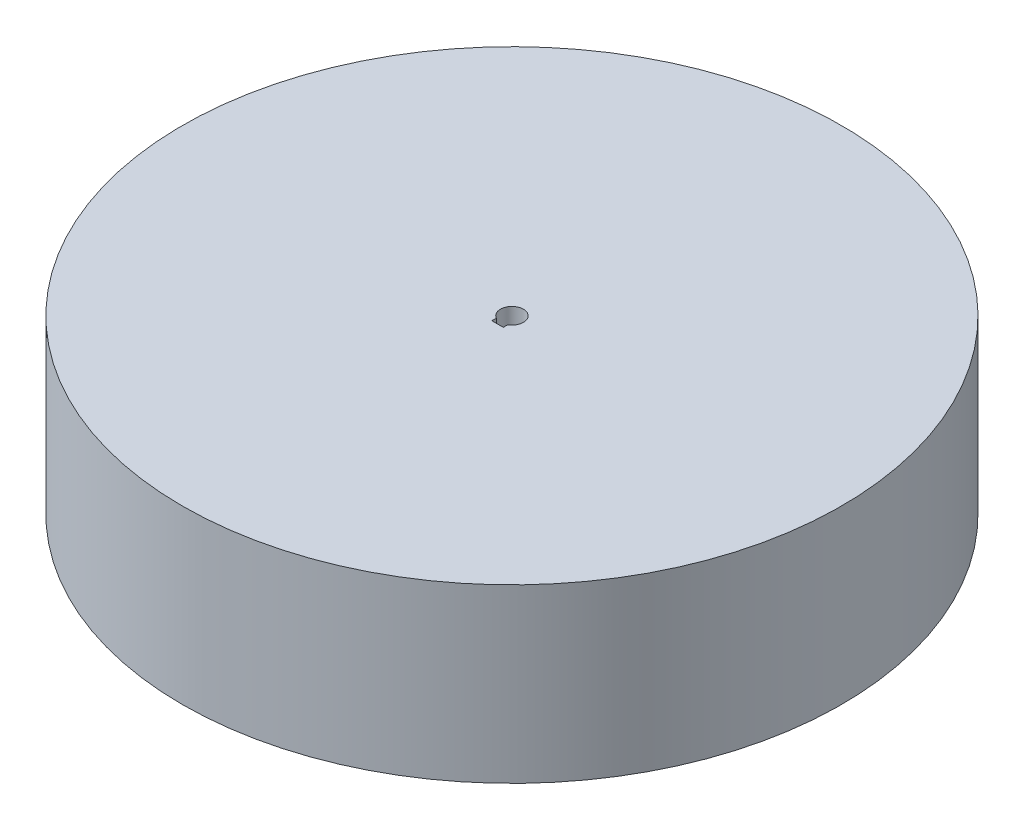
ISO-10303-21;
HEADER;
FILE_DESCRIPTION(('STEP AP214'),'2;1');
FILE_NAME('part.step','',(''),(''),'','','');
FILE_SCHEMA(('AUTOMOTIVE_DESIGN { 1 0 10303 214 1 1 1 1 }'));
ENDSEC;
DATA;
#1=APPLICATION_CONTEXT('core data for automotive mechanical design processes');
#2=APPLICATION_PROTOCOL_DEFINITION('international standard','automotive_design',2000,#1);
#3=PRODUCT_CONTEXT('',#1,'mechanical');
#4=PRODUCT('Part','Part','',(#3));
#5=PRODUCT_RELATED_PRODUCT_CATEGORY('part','',(#4));
#6=PRODUCT_DEFINITION_FORMATION('','',#4);
#7=PRODUCT_DEFINITION_CONTEXT('part definition',#1,'design');
#8=PRODUCT_DEFINITION('design','',#6,#7);
#9=PRODUCT_DEFINITION_SHAPE('','',#8);
#10=(LENGTH_UNIT() NAMED_UNIT(*) SI_UNIT(.MILLI.,.METRE.));
#11=(NAMED_UNIT(*) PLANE_ANGLE_UNIT() SI_UNIT($,.RADIAN.));
#12=(NAMED_UNIT(*) SI_UNIT($,.STERADIAN.) SOLID_ANGLE_UNIT());
#13=UNCERTAINTY_MEASURE_WITH_UNIT(LENGTH_MEASURE(1.E-05),#10,'distance_accuracy_value','');
#14=(GEOMETRIC_REPRESENTATION_CONTEXT(3) GLOBAL_UNCERTAINTY_ASSIGNED_CONTEXT((#13)) GLOBAL_UNIT_ASSIGNED_CONTEXT((#10,
#11,#12)) REPRESENTATION_CONTEXT('',''));
#15=CARTESIAN_POINT('',(0.,0.,0.));
#16=DIRECTION('',(0.,0.,1.));
#17=DIRECTION('',(1.,0.,0.));
#18=AXIS2_PLACEMENT_3D('',#15,#16,#17);
#19=CARTESIAN_POINT('',(0.,30.,0.));
#20=DIRECTION('',(0.,-1.,0.));
#21=DIRECTION('',(0.,0.,-1.));
#22=AXIS2_PLACEMENT_3D('',#19,#20,#21);
#23=CYLINDRICAL_SURFACE('',#22,57.5);
#24=CARTESIAN_POINT('',(0.,30.,0.));
#25=DIRECTION('',(0.,1.,0.));
#26=DIRECTION('',(0.,0.,1.));
#27=AXIS2_PLACEMENT_3D('',#24,#25,#26);
#28=CIRCLE('',#27,57.5);
#29=CARTESIAN_POINT('',(0.,30.,57.5));
#30=VERTEX_POINT('',#29);
#31=EDGE_CURVE('E11',#30,#30,#28,.T.);
#32=ORIENTED_EDGE('',*,*,#31,.F.);
#33=EDGE_LOOP('',(#32));
#34=FACE_BOUND('',#33,.T.);
#35=CARTESIAN_POINT('',(0.,0.,0.));
#36=DIRECTION('',(0.,1.,0.));
#37=DIRECTION('',(0.,0.,1.));
#38=AXIS2_PLACEMENT_3D('',#35,#36,#37);
#39=CIRCLE('',#38,57.5);
#40=CARTESIAN_POINT('',(0.,0.,57.5));
#41=VERTEX_POINT('',#40);
#42=EDGE_CURVE('E42',#41,#41,#39,.T.);
#43=ORIENTED_EDGE('',*,*,#42,.T.);
#44=EDGE_LOOP('',(#43));
#45=FACE_BOUND('',#44,.T.);
#46=ADVANCED_FACE('F39',(#34,#45),#23,.T.);
#47=CARTESIAN_POINT('',(0.,30.,0.));
#48=DIRECTION('',(0.,1.,0.));
#49=DIRECTION('',(0.,0.,1.));
#50=AXIS2_PLACEMENT_3D('',#47,#48,#49);
#51=PLANE('',#50);
#52=DIRECTION('',(-1.,0.,0.));
#53=VECTOR('',#52,1.);
#54=CARTESIAN_POINT('',(0.,30.,2.5));
#55=LINE('',#54,#53);
#56=CARTESIAN_POINT('',(1.,30.,2.5));
#57=VERTEX_POINT('',#56);
#58=CARTESIAN_POINT('',(-1.,30.,2.5));
#59=VERTEX_POINT('',#58);
#60=EDGE_CURVE('E83',#57,#59,#55,.T.);
#61=ORIENTED_EDGE('',*,*,#60,.T.);
#62=DIRECTION('',(0.,0.,-1.));
#63=VECTOR('',#62,1.);
#64=CARTESIAN_POINT('',(-1.,30.,0.));
#65=LINE('',#64,#63);
#66=CARTESIAN_POINT('',(-1.,30.,1.73205080756888));
#67=VERTEX_POINT('',#66);
#68=EDGE_CURVE('E93',#59,#67,#65,.T.);
#69=ORIENTED_EDGE('',*,*,#68,.T.);
#70=CARTESIAN_POINT('',(0.,30.,0.));
#71=DIRECTION('',(0.,-1.,0.));
#72=DIRECTION('',(0.,0.,-1.));
#73=AXIS2_PLACEMENT_3D('',#70,#71,#72);
#74=CIRCLE('',#73,2.);
#75=CARTESIAN_POINT('',(1.,30.,1.73205080756888));
#76=VERTEX_POINT('',#75);
#77=EDGE_CURVE('E54',#67,#76,#74,.T.);
#78=ORIENTED_EDGE('',*,*,#77,.T.);
#79=DIRECTION('',(0.,0.,-1.));
#80=VECTOR('',#79,1.);
#81=CARTESIAN_POINT('',(1.,30.,0.));
#82=LINE('',#81,#80);
#83=EDGE_CURVE('E90',#57,#76,#82,.T.);
#84=ORIENTED_EDGE('',*,*,#83,.F.);
#85=EDGE_LOOP('',(#61,#69,#78,#84));
#86=FACE_BOUND('',#85,.T.);
#87=ORIENTED_EDGE('',*,*,#31,.T.);
#88=EDGE_LOOP('',(#87));
#89=FACE_BOUND('',#88,.T.);
#90=ADVANCED_FACE('F98',(#86,#89),#51,.T.);
#91=CARTESIAN_POINT('',(0.,0.,0.));
#92=DIRECTION('',(0.,1.,0.));
#93=DIRECTION('',(0.,0.,1.));
#94=AXIS2_PLACEMENT_3D('',#91,#92,#93);
#95=PLANE('',#94);
#96=DIRECTION('',(0.,0.,-1.));
#97=VECTOR('',#96,1.);
#98=CARTESIAN_POINT('',(-1.,0.,0.));
#99=LINE('',#98,#97);
#100=CARTESIAN_POINT('',(-1.,0.,2.5));
#101=VERTEX_POINT('',#100);
#102=CARTESIAN_POINT('',(-1.,0.,1.73205080756888));
#103=VERTEX_POINT('',#102);
#104=EDGE_CURVE('E114',#101,#103,#99,.T.);
#105=ORIENTED_EDGE('',*,*,#104,.F.);
#106=DIRECTION('',(-1.,0.,0.));
#107=VECTOR('',#106,1.);
#108=CARTESIAN_POINT('',(0.,0.,2.5));
#109=LINE('',#108,#107);
#110=CARTESIAN_POINT('',(1.,0.,2.5));
#111=VERTEX_POINT('',#110);
#112=EDGE_CURVE('E62',#111,#101,#109,.T.);
#113=ORIENTED_EDGE('',*,*,#112,.F.);
#114=DIRECTION('',(0.,0.,-1.));
#115=VECTOR('',#114,1.);
#116=CARTESIAN_POINT('',(1.,0.,0.));
#117=LINE('',#116,#115);
#118=CARTESIAN_POINT('',(1.,0.,1.73205080756888));
#119=VERTEX_POINT('',#118);
#120=EDGE_CURVE('E101',#111,#119,#117,.T.);
#121=ORIENTED_EDGE('',*,*,#120,.T.);
#122=CARTESIAN_POINT('',(0.,0.,0.));
#123=DIRECTION('',(0.,-1.,0.));
#124=DIRECTION('',(0.,0.,-1.));
#125=AXIS2_PLACEMENT_3D('',#122,#123,#124);
#126=CIRCLE('',#125,2.);
#127=EDGE_CURVE('E105',#103,#119,#126,.T.);
#128=ORIENTED_EDGE('',*,*,#127,.F.);
#129=EDGE_LOOP('',(#105,#113,#121,#128));
#130=FACE_BOUND('',#129,.T.);
#131=ORIENTED_EDGE('',*,*,#42,.F.);
#132=EDGE_LOOP('',(#131));
#133=FACE_BOUND('',#132,.T.);
#134=ADVANCED_FACE('F130',(#130,#133),#95,.F.);
#135=CARTESIAN_POINT('',(0.,30.,2.5));
#136=DIRECTION('',(0.,0.,1.));
#137=DIRECTION('',(1.,0.,0.));
#138=AXIS2_PLACEMENT_3D('',#135,#136,#137);
#139=PLANE('',#138);
#140=ORIENTED_EDGE('',*,*,#112,.T.);
#141=DIRECTION('',(0.,-1.,0.));
#142=VECTOR('',#141,1.);
#143=CARTESIAN_POINT('',(-1.,30.,2.5));
#144=LINE('',#143,#142);
#145=EDGE_CURVE('E79',#59,#101,#144,.T.);
#146=ORIENTED_EDGE('',*,*,#145,.F.);
#147=ORIENTED_EDGE('',*,*,#60,.F.);
#148=DIRECTION('',(0.,-1.,0.));
#149=VECTOR('',#148,1.);
#150=CARTESIAN_POINT('',(1.,30.,2.5));
#151=LINE('',#150,#149);
#152=EDGE_CURVE('E120',#57,#111,#151,.T.);
#153=ORIENTED_EDGE('',*,*,#152,.T.);
#154=EDGE_LOOP('',(#140,#146,#147,#153));
#155=FACE_BOUND('',#154,.T.);
#156=ADVANCED_FACE('F81',(#155),#139,.F.);
#157=CARTESIAN_POINT('',(1.,30.,0.));
#158=DIRECTION('',(-1.,0.,0.));
#159=DIRECTION('',(0.,0.,1.));
#160=AXIS2_PLACEMENT_3D('',#157,#158,#159);
#161=PLANE('',#160);
#162=ORIENTED_EDGE('',*,*,#120,.F.);
#163=ORIENTED_EDGE('',*,*,#152,.F.);
#164=ORIENTED_EDGE('',*,*,#83,.T.);
#165=DIRECTION('',(0.,-1.,0.));
#166=VECTOR('',#165,1.);
#167=CARTESIAN_POINT('',(1.,30.,1.73205080756888));
#168=LINE('',#167,#166);
#169=EDGE_CURVE('E123',#76,#119,#168,.T.);
#170=ORIENTED_EDGE('',*,*,#169,.T.);
#171=EDGE_LOOP('',(#162,#163,#164,#170));
#172=FACE_BOUND('',#171,.T.);
#173=ADVANCED_FACE('F134',(#172),#161,.T.);
#174=CARTESIAN_POINT('',(0.,30.,0.));
#175=DIRECTION('',(0.,-1.,0.));
#176=DIRECTION('',(0.,0.,-1.));
#177=AXIS2_PLACEMENT_3D('',#174,#175,#176);
#178=CYLINDRICAL_SURFACE('',#177,2.);
#179=ORIENTED_EDGE('',*,*,#127,.T.);
#180=ORIENTED_EDGE('',*,*,#169,.F.);
#181=ORIENTED_EDGE('',*,*,#77,.F.);
#182=DIRECTION('',(0.,-1.,0.));
#183=VECTOR('',#182,1.);
#184=CARTESIAN_POINT('',(-1.,30.,1.73205080756888));
#185=LINE('',#184,#183);
#186=EDGE_CURVE('E89',#67,#103,#185,.T.);
#187=ORIENTED_EDGE('',*,*,#186,.T.);
#188=EDGE_LOOP('',(#179,#180,#181,#187));
#189=FACE_BOUND('',#188,.T.);
#190=ADVANCED_FACE('F127',(#189),#178,.F.);
#191=CARTESIAN_POINT('',(-1.,30.,0.));
#192=DIRECTION('',(-1.,0.,0.));
#193=DIRECTION('',(0.,0.,1.));
#194=AXIS2_PLACEMENT_3D('',#191,#192,#193);
#195=PLANE('',#194);
#196=ORIENTED_EDGE('',*,*,#104,.T.);
#197=ORIENTED_EDGE('',*,*,#186,.F.);
#198=ORIENTED_EDGE('',*,*,#68,.F.);
#199=ORIENTED_EDGE('',*,*,#145,.T.);
#200=EDGE_LOOP('',(#196,#197,#198,#199));
#201=FACE_BOUND('',#200,.T.);
#202=ADVANCED_FACE('F94',(#201),#195,.F.);
#203=CLOSED_SHELL('',(#46,#90,#134,#156,#173,#190,#202));
#204=MANIFOLD_SOLID_BREP('B2',#203);
#205=ADVANCED_BREP_SHAPE_REPRESENTATION('',(#18,#204),#14);
#206=SHAPE_DEFINITION_REPRESENTATION(#9,#205);
ENDSEC;
END-ISO-10303-21;
